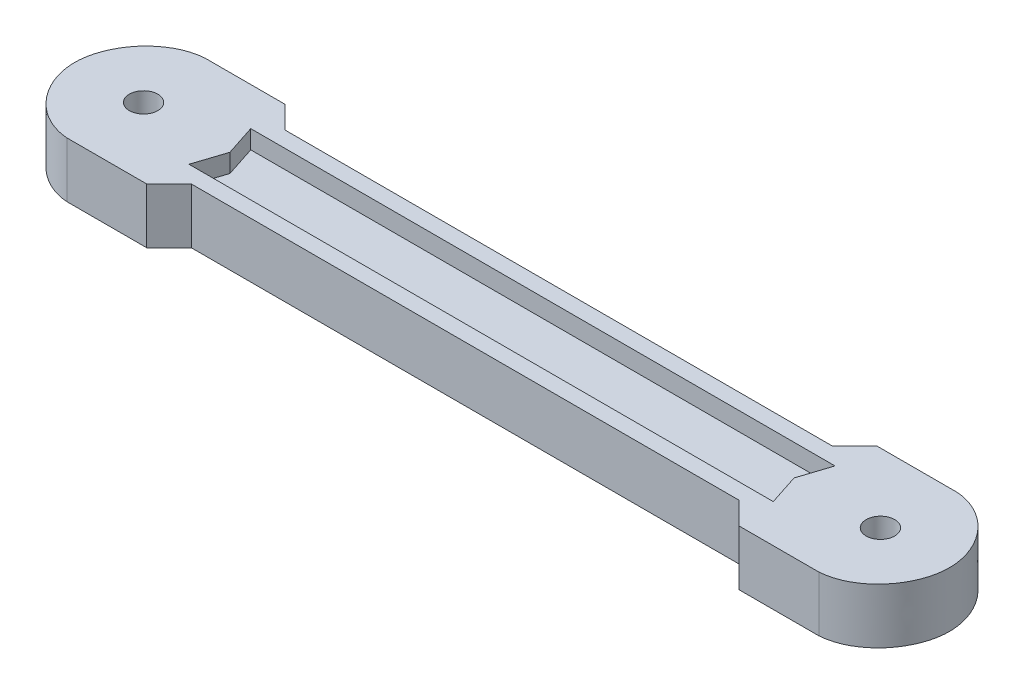
ISO-10303-21;
HEADER;
FILE_DESCRIPTION(('STEP AP214'),'2;1');
FILE_NAME('part.step','',(''),(''),'','','');
FILE_SCHEMA(('AUTOMOTIVE_DESIGN { 1 0 10303 214 1 1 1 1 }'));
ENDSEC;
DATA;
#1=APPLICATION_CONTEXT('core data for automotive mechanical design processes');
#2=APPLICATION_PROTOCOL_DEFINITION('international standard','automotive_design',2000,#1);
#3=PRODUCT_CONTEXT('',#1,'mechanical');
#4=PRODUCT('Part','Part','',(#3));
#5=PRODUCT_RELATED_PRODUCT_CATEGORY('part','',(#4));
#6=PRODUCT_DEFINITION_FORMATION('','',#4);
#7=PRODUCT_DEFINITION_CONTEXT('part definition',#1,'design');
#8=PRODUCT_DEFINITION('design','',#6,#7);
#9=PRODUCT_DEFINITION_SHAPE('','',#8);
#10=(LENGTH_UNIT() NAMED_UNIT(*) SI_UNIT(.MILLI.,.METRE.));
#11=(NAMED_UNIT(*) PLANE_ANGLE_UNIT() SI_UNIT($,.RADIAN.));
#12=(NAMED_UNIT(*) SI_UNIT($,.STERADIAN.) SOLID_ANGLE_UNIT());
#13=UNCERTAINTY_MEASURE_WITH_UNIT(LENGTH_MEASURE(1.E-05),#10,'distance_accuracy_value','');
#14=(GEOMETRIC_REPRESENTATION_CONTEXT(3) GLOBAL_UNCERTAINTY_ASSIGNED_CONTEXT((#13)) GLOBAL_UNIT_ASSIGNED_CONTEXT((#10,
#11,#12)) REPRESENTATION_CONTEXT('',''));
#15=CARTESIAN_POINT('',(0.,0.,0.));
#16=DIRECTION('',(0.,0.,1.));
#17=DIRECTION('',(1.,0.,0.));
#18=AXIS2_PLACEMENT_3D('',#15,#16,#17);
#19=CARTESIAN_POINT('',(-47.5,6.,-7.5));
#20=DIRECTION('',(0.,0.,1.));
#21=DIRECTION('',(1.,0.,0.));
#22=AXIS2_PLACEMENT_3D('',#19,#20,#21);
#23=PLANE('',#22);
#24=DIRECTION('',(0.,1.,0.));
#25=VECTOR('',#24,1.);
#26=CARTESIAN_POINT('',(40.8154783819914,-6.,-7.50000000000002));
#27=LINE('',#26,#25);
#28=CARTESIAN_POINT('',(40.8154783819915,0.,-7.50000000000001));
#29=VERTEX_POINT('',#28);
#30=CARTESIAN_POINT('',(40.8154783819915,6.,-7.50000000000001));
#31=VERTEX_POINT('',#30);
#32=EDGE_CURVE('E269',#29,#31,#27,.T.);
#33=ORIENTED_EDGE('',*,*,#32,.F.);
#34=DIRECTION('',(-1.,0.,0.));
#35=VECTOR('',#34,1.);
#36=CARTESIAN_POINT('',(-47.5,0.,-7.5));
#37=LINE('',#36,#35);
#38=CARTESIAN_POINT('',(32.1591580722005,0.,-7.50000000000001));
#39=VERTEX_POINT('',#38);
#40=EDGE_CURVE('E272',#29,#39,#37,.T.);
#41=ORIENTED_EDGE('',*,*,#40,.T.);
#42=DIRECTION('',(0.,1.,0.));
#43=VECTOR('',#42,1.);
#44=CARTESIAN_POINT('',(32.1591580722005,-6.,-7.50000000000002));
#45=LINE('',#44,#43);
#46=CARTESIAN_POINT('',(32.1591580722005,6.,-7.50000000000002));
#47=VERTEX_POINT('',#46);
#48=EDGE_CURVE('E335',#39,#47,#45,.T.);
#49=ORIENTED_EDGE('',*,*,#48,.T.);
#50=DIRECTION('',(-1.,0.,0.));
#51=VECTOR('',#50,1.);
#52=CARTESIAN_POINT('',(-47.5,6.,-7.5));
#53=LINE('',#52,#51);
#54=EDGE_CURVE('E274',#31,#47,#53,.T.);
#55=ORIENTED_EDGE('',*,*,#54,.F.);
#56=EDGE_LOOP('',(#33,#41,#49,#55));
#57=FACE_BOUND('',#56,.T.);
#58=ADVANCED_FACE('F33',(#57),#23,.F.);
#59=DIRECTION('',(0.,1.,0.));
#60=VECTOR('',#59,1.);
#61=CARTESIAN_POINT('',(-40.8154783819917,-6.,-7.5));
#62=LINE('',#61,#60);
#63=CARTESIAN_POINT('',(-40.8154783819918,6.,-7.5));
#64=VERTEX_POINT('',#63);
#65=CARTESIAN_POINT('',(-40.8154783819918,0.,-7.5));
#66=VERTEX_POINT('',#65);
#67=EDGE_CURVE('E351',#64,#66,#62,.F.);
#68=ORIENTED_EDGE('',*,*,#67,.F.);
#69=CARTESIAN_POINT('',(-32.1591580722005,6.,-7.50000000000002));
#70=VERTEX_POINT('',#69);
#71=EDGE_CURVE('E354',#70,#64,#53,.T.);
#72=ORIENTED_EDGE('',*,*,#71,.F.);
#73=DIRECTION('',(0.,1.,0.));
#74=VECTOR('',#73,1.);
#75=CARTESIAN_POINT('',(-32.1591580722005,-6.,-7.50000000000002));
#76=LINE('',#75,#74);
#77=CARTESIAN_POINT('',(-32.1591580722005,0.,-7.50000000000002));
#78=VERTEX_POINT('',#77);
#79=EDGE_CURVE('E331',#78,#70,#76,.T.);
#80=ORIENTED_EDGE('',*,*,#79,.F.);
#81=EDGE_CURVE('E55',#78,#66,#37,.T.);
#82=ORIENTED_EDGE('',*,*,#81,.T.);
#83=EDGE_LOOP('',(#68,#72,#80,#82));
#84=FACE_BOUND('',#83,.T.);
#85=ADVANCED_FACE('F255',(#84),#23,.F.);
#86=CARTESIAN_POINT('',(-47.5,6.,7.5));
#87=DIRECTION('',(0.,0.,-1.));
#88=DIRECTION('',(-1.,0.,0.));
#89=AXIS2_PLACEMENT_3D('',#86,#87,#88);
#90=PLANE('',#89);
#91=DIRECTION('',(1.,0.,0.));
#92=VECTOR('',#91,1.);
#93=CARTESIAN_POINT('',(-47.5,0.,7.5));
#94=LINE('',#93,#92);
#95=CARTESIAN_POINT('',(32.1591580722005,0.,7.50000000000002));
#96=VERTEX_POINT('',#95);
#97=CARTESIAN_POINT('',(40.8154783799446,0.,7.50000000000002));
#98=VERTEX_POINT('',#97);
#99=EDGE_CURVE('E286',#96,#98,#94,.T.);
#100=ORIENTED_EDGE('',*,*,#99,.T.);
#101=DIRECTION('',(0.,1.,0.));
#102=VECTOR('',#101,1.);
#103=CARTESIAN_POINT('',(40.8154783799445,-6.,7.50000000000001));
#104=LINE('',#103,#102);
#105=CARTESIAN_POINT('',(40.8154783799446,6.,7.50000000000001));
#106=VERTEX_POINT('',#105);
#107=EDGE_CURVE('E277',#106,#98,#104,.F.);
#108=ORIENTED_EDGE('',*,*,#107,.F.);
#109=DIRECTION('',(1.,0.,0.));
#110=VECTOR('',#109,1.);
#111=CARTESIAN_POINT('',(-47.5,6.,7.5));
#112=LINE('',#111,#110);
#113=CARTESIAN_POINT('',(32.1591580722005,6.,7.50000000000002));
#114=VERTEX_POINT('',#113);
#115=EDGE_CURVE('E291',#114,#106,#112,.T.);
#116=ORIENTED_EDGE('',*,*,#115,.F.);
#117=DIRECTION('',(0.,1.,0.));
#118=VECTOR('',#117,1.);
#119=CARTESIAN_POINT('',(32.1591580722005,-6.,7.50000000000002));
#120=LINE('',#119,#118);
#121=EDGE_CURVE('E340',#96,#114,#120,.T.);
#122=ORIENTED_EDGE('',*,*,#121,.F.);
#123=EDGE_LOOP('',(#100,#108,#116,#122));
#124=FACE_BOUND('',#123,.T.);
#125=ADVANCED_FACE('F253',(#124),#90,.F.);
#126=DIRECTION('',(0.,1.,0.));
#127=VECTOR('',#126,1.);
#128=CARTESIAN_POINT('',(-40.8154783799448,-6.,7.5));
#129=LINE('',#128,#127);
#130=CARTESIAN_POINT('',(-40.8154783799449,0.,7.49999999999999));
#131=VERTEX_POINT('',#130);
#132=CARTESIAN_POINT('',(-40.8154783799449,6.,7.49999999999999));
#133=VERTEX_POINT('',#132);
#134=EDGE_CURVE('E333',#131,#133,#129,.T.);
#135=ORIENTED_EDGE('',*,*,#134,.F.);
#136=CARTESIAN_POINT('',(-32.1591580722005,0.,7.5));
#137=VERTEX_POINT('',#136);
#138=EDGE_CURVE('E288',#131,#137,#94,.T.);
#139=ORIENTED_EDGE('',*,*,#138,.T.);
#140=DIRECTION('',(0.,1.,0.));
#141=VECTOR('',#140,1.);
#142=CARTESIAN_POINT('',(-32.1591580722005,-6.,7.50000000000002));
#143=LINE('',#142,#141);
#144=CARTESIAN_POINT('',(-32.1591580722005,6.,7.50000000000002));
#145=VERTEX_POINT('',#144);
#146=EDGE_CURVE('E346',#137,#145,#143,.T.);
#147=ORIENTED_EDGE('',*,*,#146,.T.);
#148=EDGE_CURVE('E300',#133,#145,#112,.T.);
#149=ORIENTED_EDGE('',*,*,#148,.F.);
#150=EDGE_LOOP('',(#135,#139,#147,#149));
#151=FACE_BOUND('',#150,.T.);
#152=ADVANCED_FACE('F249',(#151),#90,.F.);
#153=CARTESIAN_POINT('',(0.,6.,0.));
#154=DIRECTION('',(0.,-1.,0.));
#155=DIRECTION('',(0.,0.,-1.));
#156=AXIS2_PLACEMENT_3D('',#153,#154,#155);
#157=PLANE('',#156);
#158=DIRECTION('',(1.,0.,0.));
#159=VECTOR('',#158,1.);
#160=CARTESIAN_POINT('',(-31.7174150880341,6.,3.35193649705162));
#161=LINE('',#160,#159);
#162=CARTESIAN_POINT('',(-31.7174150880341,6.,3.35193649705162));
#163=VERTEX_POINT('',#162);
#164=CARTESIAN_POINT('',(31.7174150880341,6.,3.35193649705162));
#165=VERTEX_POINT('',#164);
#166=EDGE_CURVE('E194',#163,#165,#161,.T.);
#167=ORIENTED_EDGE('',*,*,#166,.F.);
#168=DIRECTION('',(-0.309876944964652,0.,0.950776671453067));
#169=VECTOR('',#168,1.);
#170=CARTESIAN_POINT('',(-30.6249526069823,6.,0.));
#171=LINE('',#170,#169);
#172=CARTESIAN_POINT('',(-30.6249526069823,6.,0.));
#173=VERTEX_POINT('',#172);
#174=EDGE_CURVE('E47',#173,#163,#171,.T.);
#175=ORIENTED_EDGE('',*,*,#174,.F.);
#176=DIRECTION('',(0.309876944964652,0.,0.950776671453067));
#177=VECTOR('',#176,1.);
#178=CARTESIAN_POINT('',(-30.6249526069823,6.,0.));
#179=LINE('',#178,#177);
#180=CARTESIAN_POINT('',(-31.7174150880341,6.,-3.35193649705162));
#181=VERTEX_POINT('',#180);
#182=EDGE_CURVE('E180',#181,#173,#179,.T.);
#183=ORIENTED_EDGE('',*,*,#182,.F.);
#184=DIRECTION('',(-1.,0.,0.));
#185=VECTOR('',#184,1.);
#186=CARTESIAN_POINT('',(-31.7174150880341,6.,-3.35193649705162));
#187=LINE('',#186,#185);
#188=CARTESIAN_POINT('',(31.7174150880341,6.,-3.35193649705162));
#189=VERTEX_POINT('',#188);
#190=EDGE_CURVE('E183',#189,#181,#187,.T.);
#191=ORIENTED_EDGE('',*,*,#190,.F.);
#192=DIRECTION('',(0.309876944964652,0.,-0.950776671453067));
#193=VECTOR('',#192,1.);
#194=CARTESIAN_POINT('',(30.6249526069823,6.,0.));
#195=LINE('',#194,#193);
#196=CARTESIAN_POINT('',(30.6249526069823,6.,0.));
#197=VERTEX_POINT('',#196);
#198=EDGE_CURVE('E199',#197,#189,#195,.T.);
#199=ORIENTED_EDGE('',*,*,#198,.F.);
#200=DIRECTION('',(-0.309876944964652,0.,-0.950776671453067));
#201=VECTOR('',#200,1.);
#202=CARTESIAN_POINT('',(30.6249526069823,6.,0.));
#203=LINE('',#202,#201);
#204=EDGE_CURVE('E196',#165,#197,#203,.T.);
#205=ORIENTED_EDGE('',*,*,#204,.F.);
#206=EDGE_LOOP('',(#167,#175,#183,#191,#199,#205));
#207=FACE_BOUND('',#206,.T.);
#208=CARTESIAN_POINT('',(-40.,6.,0.));
#209=DIRECTION('',(0.,-1.,0.));
#210=DIRECTION('',(0.,0.,-1.));
#211=AXIS2_PLACEMENT_3D('',#208,#209,#210);
#212=CIRCLE('',#211,1.54999999999999);
#213=CARTESIAN_POINT('',(-40.,6.,-1.54999999999999));
#214=VERTEX_POINT('',#213);
#215=EDGE_CURVE('E222',#214,#214,#212,.T.);
#216=ORIENTED_EDGE('',*,*,#215,.T.);
#217=EDGE_LOOP('',(#216));
#218=FACE_BOUND('',#217,.T.);
#219=CARTESIAN_POINT('',(40.,6.,0.));
#220=DIRECTION('',(0.,-1.,0.));
#221=DIRECTION('',(0.,0.,-1.));
#222=AXIS2_PLACEMENT_3D('',#219,#220,#221);
#223=CIRCLE('',#222,1.54999999999999);
#224=CARTESIAN_POINT('',(40.,6.,-1.54999999999999));
#225=VERTEX_POINT('',#224);
#226=EDGE_CURVE('E217',#225,#225,#223,.T.);
#227=ORIENTED_EDGE('',*,*,#226,.T.);
#228=EDGE_LOOP('',(#227));
#229=FACE_BOUND('',#228,.T.);
#230=DIRECTION('',(-0.707106781186555,0.,-0.70710678118654));
#231=VECTOR('',#230,1.);
#232=CARTESIAN_POINT('',(-32.1591580722005,6.,-7.50000000000002));
#233=LINE('',#232,#231);
#234=CARTESIAN_POINT('',(-29.7385162336034,6.,-5.07935816140295));
#235=VERTEX_POINT('',#234);
#236=EDGE_CURVE('E329',#235,#70,#233,.T.);
#237=ORIENTED_EDGE('',*,*,#236,.T.);
#238=ORIENTED_EDGE('',*,*,#71,.T.);
#239=CARTESIAN_POINT('',(-40.,6.,-7.50000000000002));
#240=CARTESIAN_POINT('',(-44.0851812404319,6.,-7.7739570541338));
#241=CARTESIAN_POINT('',(-50.9148187585371,6.,8.00605583846533E-10));
#242=CARTESIAN_POINT('',(-44.0851812424938,6.,7.77395705319477));
#243=CARTESIAN_POINT('',(-40.,6.,7.50000000000002));
#244=B_SPLINE_CURVE_WITH_KNOTS('',3,(#239,#240,#241,#242,#243),.UNSPECIFIED.,.F.,.F.,(4,1,4),
(0.,0.499999999989353,1.),.UNSPECIFIED.);
#245=EDGE_CURVE('E225',#64,#133,#244,.T.);
#246=ORIENTED_EDGE('',*,*,#245,.T.);
#247=ORIENTED_EDGE('',*,*,#148,.T.);
#248=DIRECTION('',(0.707106781186555,0.,-0.70710678118654));
#249=VECTOR('',#248,1.);
#250=CARTESIAN_POINT('',(-32.1591580722005,6.,7.50000000000002));
#251=LINE('',#250,#249);
#252=CARTESIAN_POINT('',(-29.7385162336034,6.,5.07935816140295));
#253=VERTEX_POINT('',#252);
#254=EDGE_CURVE('E366',#145,#253,#251,.T.);
#255=ORIENTED_EDGE('',*,*,#254,.T.);
#256=DIRECTION('',(1.,0.,0.));
#257=VECTOR('',#256,1.);
#258=CARTESIAN_POINT('',(-29.7385162336034,6.,5.07935816140295));
#259=LINE('',#258,#257);
#260=CARTESIAN_POINT('',(29.7385162336034,6.,5.07935816140295));
#261=VERTEX_POINT('',#260);
#262=EDGE_CURVE('E380',#253,#261,#259,.T.);
#263=ORIENTED_EDGE('',*,*,#262,.T.);
#264=DIRECTION('',(0.707106781186555,0.,0.70710678118654));
#265=VECTOR('',#264,1.);
#266=CARTESIAN_POINT('',(32.1591580722005,6.,7.50000000000002));
#267=LINE('',#266,#265);
#268=EDGE_CURVE('E376',#261,#114,#267,.T.);
#269=ORIENTED_EDGE('',*,*,#268,.T.);
#270=ORIENTED_EDGE('',*,*,#115,.T.);
#271=CARTESIAN_POINT('',(40.,6.,7.50000000000002));
#272=CARTESIAN_POINT('',(44.0851812424938,6.,7.77395705319477));
#273=CARTESIAN_POINT('',(50.9148187585372,6.,8.00606389292552E-10));
#274=CARTESIAN_POINT('',(44.0851812404319,6.,-7.7739570541338));
#275=CARTESIAN_POINT('',(40.,6.,-7.50000000000002));
#276=B_SPLINE_CURVE_WITH_KNOTS('',3,(#271,#272,#273,#274,#275),.UNSPECIFIED.,.F.,.F.,(4,1,4),
(0.,0.500000000010647,1.),.UNSPECIFIED.);
#277=EDGE_CURVE('E379',#106,#31,#276,.T.);
#278=ORIENTED_EDGE('',*,*,#277,.T.);
#279=ORIENTED_EDGE('',*,*,#54,.T.);
#280=DIRECTION('',(-0.707106781186555,0.,0.70710678118654));
#281=VECTOR('',#280,1.);
#282=CARTESIAN_POINT('',(32.1591580722005,6.,-7.50000000000002));
#283=LINE('',#282,#281);
#284=CARTESIAN_POINT('',(29.7385162336034,6.,-5.07935816140295));
#285=VERTEX_POINT('',#284);
#286=EDGE_CURVE('E388',#47,#285,#283,.T.);
#287=ORIENTED_EDGE('',*,*,#286,.T.);
#288=DIRECTION('',(-1.,0.,0.));
#289=VECTOR('',#288,1.);
#290=CARTESIAN_POINT('',(-29.7385162336034,6.,-5.07935816140295));
#291=LINE('',#290,#289);
#292=EDGE_CURVE('E394',#285,#235,#291,.T.);
#293=ORIENTED_EDGE('',*,*,#292,.T.);
#294=EDGE_LOOP('',(#237,#238,#246,#247,#255,#263,#269,#270,#278,#279,#287,#293));
#295=FACE_BOUND('',#294,.T.);
#296=ADVANCED_FACE('F246',(#207,#218,#229,#295),#157,.F.);
#297=CARTESIAN_POINT('',(0.,0.,0.));
#298=DIRECTION('',(0.,-1.,0.));
#299=DIRECTION('',(0.,0.,-1.));
#300=AXIS2_PLACEMENT_3D('',#297,#298,#299);
#301=PLANE('',#300);
#302=CARTESIAN_POINT('',(-40.,0.,0.));
#303=DIRECTION('',(0.,-1.,0.));
#304=DIRECTION('',(0.,0.,-1.));
#305=AXIS2_PLACEMENT_3D('',#302,#303,#304);
#306=CIRCLE('',#305,1.54999999999999);
#307=CARTESIAN_POINT('',(-40.,0.,-1.54999999999999));
#308=VERTEX_POINT('',#307);
#309=EDGE_CURVE('E214',#308,#308,#306,.T.);
#310=ORIENTED_EDGE('',*,*,#309,.F.);
#311=EDGE_LOOP('',(#310));
#312=FACE_BOUND('',#311,.T.);
#313=CARTESIAN_POINT('',(40.,0.,0.));
#314=DIRECTION('',(0.,-1.,0.));
#315=DIRECTION('',(0.,0.,1.));
#316=AXIS2_PLACEMENT_3D('',#313,#314,#315);
#317=CIRCLE('',#316,1.54999999999999);
#318=CARTESIAN_POINT('',(40.,0.,1.54999999999999));
#319=VERTEX_POINT('',#318);
#320=EDGE_CURVE('E206',#319,#319,#317,.T.);
#321=ORIENTED_EDGE('',*,*,#320,.F.);
#322=EDGE_LOOP('',(#321));
#323=FACE_BOUND('',#322,.T.);
#324=ORIENTED_EDGE('',*,*,#81,.F.);
#325=DIRECTION('',(0.707106781186555,0.,0.70710678118654));
#326=VECTOR('',#325,1.);
#327=CARTESIAN_POINT('',(-12.3295790360999,0.,12.3295790361002));
#328=LINE('',#327,#326);
#329=CARTESIAN_POINT('',(-29.7385162336034,0.,-5.07935816140295));
#330=VERTEX_POINT('',#329);
#331=EDGE_CURVE('E11',#78,#330,#328,.T.);
#332=ORIENTED_EDGE('',*,*,#331,.T.);
#333=DIRECTION('',(1.,0.,0.));
#334=VECTOR('',#333,1.);
#335=CARTESIAN_POINT('',(0.,0.,-5.07935816140295));
#336=LINE('',#335,#334);
#337=CARTESIAN_POINT('',(29.7385162336034,0.,-5.07935816140295));
#338=VERTEX_POINT('',#337);
#339=EDGE_CURVE('E40',#330,#338,#336,.T.);
#340=ORIENTED_EDGE('',*,*,#339,.T.);
#341=DIRECTION('',(0.707106781186555,0.,-0.70710678118654));
#342=VECTOR('',#341,1.);
#343=CARTESIAN_POINT('',(12.3295790360999,0.,12.3295790361002));
#344=LINE('',#343,#342);
#345=EDGE_CURVE('E285',#338,#39,#344,.T.);
#346=ORIENTED_EDGE('',*,*,#345,.T.);
#347=ORIENTED_EDGE('',*,*,#40,.F.);
#348=CARTESIAN_POINT('',(40.,0.,7.50000000000002));
#349=CARTESIAN_POINT('',(44.0851812424938,0.,7.77395705319477));
#350=CARTESIAN_POINT('',(50.9148187585372,0.,8.00606389292552E-10));
#351=CARTESIAN_POINT('',(44.0851812404319,0.,-7.7739570541338));
#352=CARTESIAN_POINT('',(40.,0.,-7.50000000000002));
#353=B_SPLINE_CURVE_WITH_KNOTS('',3,(#348,#349,#350,#351,#352),.UNSPECIFIED.,.F.,.F.,(4,1,4),
(0.,0.500000000010647,1.),.UNSPECIFIED.);
#354=EDGE_CURVE('E283',#29,#98,#353,.F.);
#355=ORIENTED_EDGE('',*,*,#354,.T.);
#356=ORIENTED_EDGE('',*,*,#99,.F.);
#357=DIRECTION('',(-0.707106781186555,0.,-0.70710678118654));
#358=VECTOR('',#357,1.);
#359=CARTESIAN_POINT('',(12.3295790360999,0.,-12.3295790361002));
#360=LINE('',#359,#358);
#361=CARTESIAN_POINT('',(29.7385162336034,0.,5.07935816140295));
#362=VERTEX_POINT('',#361);
#363=EDGE_CURVE('E309',#96,#362,#360,.T.);
#364=ORIENTED_EDGE('',*,*,#363,.T.);
#365=DIRECTION('',(-1.,0.,0.));
#366=VECTOR('',#365,1.);
#367=CARTESIAN_POINT('',(0.,0.,5.07935816140295));
#368=LINE('',#367,#366);
#369=CARTESIAN_POINT('',(-29.7385162336034,0.,5.07935816140295));
#370=VERTEX_POINT('',#369);
#371=EDGE_CURVE('E306',#362,#370,#368,.T.);
#372=ORIENTED_EDGE('',*,*,#371,.T.);
#373=DIRECTION('',(-0.707106781186555,0.,0.70710678118654));
#374=VECTOR('',#373,1.);
#375=CARTESIAN_POINT('',(-12.3295790360999,0.,-12.3295790361002));
#376=LINE('',#375,#374);
#377=EDGE_CURVE('E299',#370,#137,#376,.T.);
#378=ORIENTED_EDGE('',*,*,#377,.T.);
#379=ORIENTED_EDGE('',*,*,#138,.F.);
#380=CARTESIAN_POINT('',(-40.,0.,-7.50000000000002));
#381=CARTESIAN_POINT('',(-44.0851812404319,0.,-7.7739570541338));
#382=CARTESIAN_POINT('',(-50.9148187585371,0.,8.00605583846533E-10));
#383=CARTESIAN_POINT('',(-44.0851812424938,0.,7.77395705319477));
#384=CARTESIAN_POINT('',(-40.,0.,7.50000000000002));
#385=B_SPLINE_CURVE_WITH_KNOTS('',3,(#380,#381,#382,#383,#384),.UNSPECIFIED.,.F.,.F.,(4,1,4),
(0.,0.499999999989353,1.),.UNSPECIFIED.);
#386=EDGE_CURVE('E294',#131,#66,#385,.F.);
#387=ORIENTED_EDGE('',*,*,#386,.T.);
#388=EDGE_LOOP('',(#324,#332,#340,#346,#347,#355,#356,#364,#372,#378,#379,#387));
#389=FACE_BOUND('',#388,.T.);
#390=ADVANCED_FACE('F243',(#312,#323,#389),#301,.T.);
#391=CARTESIAN_POINT('',(-40.,-6.,-7.50000000000002));
#392=CARTESIAN_POINT('',(-44.0851812404319,-6.,-7.7739570541338));
#393=CARTESIAN_POINT('',(-50.9148187585371,-6.,8.00605583846533E-10));
#394=CARTESIAN_POINT('',(-44.0851812424938,-6.,7.77395705319477));
#395=CARTESIAN_POINT('',(-40.,-6.,7.50000000000002));
#396=B_SPLINE_CURVE_WITH_KNOTS('',3,(#391,#392,#393,#394,#395),.UNSPECIFIED.,.F.,.F.,(4,1,4),
(0.,0.499999999989353,1.),.UNSPECIFIED.);
#397=DIRECTION('',(0.,1.,0.));
#398=VECTOR('',#397,1.);
#399=SURFACE_OF_LINEAR_EXTRUSION('',#396,#398);
#400=ORIENTED_EDGE('',*,*,#386,.F.);
#401=ORIENTED_EDGE('',*,*,#134,.T.);
#402=ORIENTED_EDGE('',*,*,#245,.F.);
#403=ORIENTED_EDGE('',*,*,#67,.T.);
#404=EDGE_LOOP('',(#400,#401,#402,#403));
#405=FACE_BOUND('',#404,.T.);
#406=ADVANCED_FACE('F238',(#405),#399,.T.);
#407=CARTESIAN_POINT('',(-32.1591580722005,-6.,7.50000000000002));
#408=DIRECTION('',(0.70710678118654,0.,0.707106781186555));
#409=DIRECTION('',(0.707106781186555,0.,-0.70710678118654));
#410=AXIS2_PLACEMENT_3D('',#407,#408,#409);
#411=PLANE('',#410);
#412=DIRECTION('',(0.,1.,0.));
#413=VECTOR('',#412,1.);
#414=CARTESIAN_POINT('',(-29.7385162336034,-6.,5.07935816140295));
#415=LINE('',#414,#413);
#416=EDGE_CURVE('E344',#370,#253,#415,.T.);
#417=ORIENTED_EDGE('',*,*,#416,.T.);
#418=ORIENTED_EDGE('',*,*,#254,.F.);
#419=ORIENTED_EDGE('',*,*,#146,.F.);
#420=ORIENTED_EDGE('',*,*,#377,.F.);
#421=EDGE_LOOP('',(#417,#418,#419,#420));
#422=FACE_BOUND('',#421,.T.);
#423=ADVANCED_FACE('F242',(#422),#411,.T.);
#424=CARTESIAN_POINT('',(-29.7385162336034,-6.,5.07935816140295));
#425=DIRECTION('',(0.,0.,1.));
#426=DIRECTION('',(1.,0.,0.));
#427=AXIS2_PLACEMENT_3D('',#424,#425,#426);
#428=PLANE('',#427);
#429=DIRECTION('',(0.,1.,0.));
#430=VECTOR('',#429,1.);
#431=CARTESIAN_POINT('',(29.7385162336034,-6.,5.07935816140295));
#432=LINE('',#431,#430);
#433=EDGE_CURVE('E342',#362,#261,#432,.T.);
#434=ORIENTED_EDGE('',*,*,#433,.T.);
#435=ORIENTED_EDGE('',*,*,#262,.F.);
#436=ORIENTED_EDGE('',*,*,#416,.F.);
#437=ORIENTED_EDGE('',*,*,#371,.F.);
#438=EDGE_LOOP('',(#434,#435,#436,#437));
#439=FACE_BOUND('',#438,.T.);
#440=ADVANCED_FACE('F369',(#439),#428,.T.);
#441=CARTESIAN_POINT('',(32.1591580722005,-6.,7.50000000000002));
#442=DIRECTION('',(-0.70710678118654,0.,0.707106781186555));
#443=DIRECTION('',(0.707106781186555,0.,0.70710678118654));
#444=AXIS2_PLACEMENT_3D('',#441,#442,#443);
#445=PLANE('',#444);
#446=ORIENTED_EDGE('',*,*,#121,.T.);
#447=ORIENTED_EDGE('',*,*,#268,.F.);
#448=ORIENTED_EDGE('',*,*,#433,.F.);
#449=ORIENTED_EDGE('',*,*,#363,.F.);
#450=EDGE_LOOP('',(#446,#447,#448,#449));
#451=FACE_BOUND('',#450,.T.);
#452=ADVANCED_FACE('F373',(#451),#445,.T.);
#453=CARTESIAN_POINT('',(40.,-6.,7.50000000000002));
#454=CARTESIAN_POINT('',(44.0851812424938,-6.,7.77395705319477));
#455=CARTESIAN_POINT('',(50.9148187585372,-6.,8.00606389292552E-10));
#456=CARTESIAN_POINT('',(44.0851812404319,-6.,-7.7739570541338));
#457=CARTESIAN_POINT('',(40.,-6.,-7.50000000000002));
#458=B_SPLINE_CURVE_WITH_KNOTS('',3,(#453,#454,#455,#456,#457),.UNSPECIFIED.,.F.,.F.,(4,1,4),
(0.,0.500000000010647,1.),.UNSPECIFIED.);
#459=DIRECTION('',(0.,1.,0.));
#460=VECTOR('',#459,1.);
#461=SURFACE_OF_LINEAR_EXTRUSION('',#458,#460);
#462=ORIENTED_EDGE('',*,*,#354,.F.);
#463=ORIENTED_EDGE('',*,*,#32,.T.);
#464=ORIENTED_EDGE('',*,*,#277,.F.);
#465=ORIENTED_EDGE('',*,*,#107,.T.);
#466=EDGE_LOOP('',(#462,#463,#464,#465));
#467=FACE_BOUND('',#466,.T.);
#468=ADVANCED_FACE('F401',(#467),#461,.T.);
#469=CARTESIAN_POINT('',(-32.1591580722005,-6.,-7.50000000000002));
#470=DIRECTION('',(0.70710678118654,0.,-0.707106781186555));
#471=DIRECTION('',(-0.707106781186555,0.,-0.70710678118654));
#472=AXIS2_PLACEMENT_3D('',#469,#470,#471);
#473=PLANE('',#472);
#474=ORIENTED_EDGE('',*,*,#79,.T.);
#475=ORIENTED_EDGE('',*,*,#236,.F.);
#476=DIRECTION('',(0.,1.,0.));
#477=VECTOR('',#476,1.);
#478=CARTESIAN_POINT('',(-29.7385162336034,-6.,-5.07935816140295));
#479=LINE('',#478,#477);
#480=EDGE_CURVE('E323',#330,#235,#479,.T.);
#481=ORIENTED_EDGE('',*,*,#480,.F.);
#482=ORIENTED_EDGE('',*,*,#331,.F.);
#483=EDGE_LOOP('',(#474,#475,#481,#482));
#484=FACE_BOUND('',#483,.T.);
#485=ADVANCED_FACE('F327',(#484),#473,.T.);
#486=CARTESIAN_POINT('',(-29.7385162336034,-6.,-5.07935816140295));
#487=DIRECTION('',(0.,0.,-1.));
#488=DIRECTION('',(-1.,0.,0.));
#489=AXIS2_PLACEMENT_3D('',#486,#487,#488);
#490=PLANE('',#489);
#491=ORIENTED_EDGE('',*,*,#480,.T.);
#492=ORIENTED_EDGE('',*,*,#292,.F.);
#493=DIRECTION('',(0.,1.,0.));
#494=VECTOR('',#493,1.);
#495=CARTESIAN_POINT('',(29.7385162336034,-6.,-5.07935816140295));
#496=LINE('',#495,#494);
#497=EDGE_CURVE('E325',#338,#285,#496,.T.);
#498=ORIENTED_EDGE('',*,*,#497,.F.);
#499=ORIENTED_EDGE('',*,*,#339,.F.);
#500=EDGE_LOOP('',(#491,#492,#498,#499));
#501=FACE_BOUND('',#500,.T.);
#502=ADVANCED_FACE('F321',(#501),#490,.T.);
#503=CARTESIAN_POINT('',(32.1591580722005,-6.,-7.50000000000002));
#504=DIRECTION('',(-0.70710678118654,0.,-0.707106781186555));
#505=DIRECTION('',(-0.707106781186555,0.,0.70710678118654));
#506=AXIS2_PLACEMENT_3D('',#503,#504,#505);
#507=PLANE('',#506);
#508=ORIENTED_EDGE('',*,*,#497,.T.);
#509=ORIENTED_EDGE('',*,*,#286,.F.);
#510=ORIENTED_EDGE('',*,*,#48,.F.);
#511=ORIENTED_EDGE('',*,*,#345,.F.);
#512=EDGE_LOOP('',(#508,#509,#510,#511));
#513=FACE_BOUND('',#512,.T.);
#514=ADVANCED_FACE('F411',(#513),#507,.T.);
#515=CARTESIAN_POINT('',(40.,12.,0.));
#516=DIRECTION('',(0.,-1.,0.));
#517=DIRECTION('',(0.,0.,-1.));
#518=AXIS2_PLACEMENT_3D('',#515,#516,#517);
#519=CYLINDRICAL_SURFACE('',#518,1.54999999999999);
#520=ORIENTED_EDGE('',*,*,#320,.T.);
#521=EDGE_LOOP('',(#520));
#522=FACE_BOUND('',#521,.T.);
#523=ORIENTED_EDGE('',*,*,#226,.F.);
#524=EDGE_LOOP('',(#523));
#525=FACE_BOUND('',#524,.T.);
#526=ADVANCED_FACE('F490',(#522,#525),#519,.F.);
#527=CARTESIAN_POINT('',(-40.,12.,0.));
#528=DIRECTION('',(0.,-1.,0.));
#529=DIRECTION('',(0.,0.,-1.));
#530=AXIS2_PLACEMENT_3D('',#527,#528,#529);
#531=CYLINDRICAL_SURFACE('',#530,1.54999999999999);
#532=ORIENTED_EDGE('',*,*,#309,.T.);
#533=EDGE_LOOP('',(#532));
#534=FACE_BOUND('',#533,.T.);
#535=ORIENTED_EDGE('',*,*,#215,.F.);
#536=EDGE_LOOP('',(#535));
#537=FACE_BOUND('',#536,.T.);
#538=ADVANCED_FACE('F497',(#534,#537),#531,.F.);
#539=CARTESIAN_POINT('',(-30.6249526069823,4.,0.));
#540=DIRECTION('',(-0.950776671453067,0.,-0.309876944964652));
#541=DIRECTION('',(-0.309876944964652,0.,0.950776671453067));
#542=AXIS2_PLACEMENT_3D('',#539,#540,#541);
#543=PLANE('',#542);
#544=ORIENTED_EDGE('',*,*,#174,.T.);
#545=DIRECTION('',(0.,1.,0.));
#546=VECTOR('',#545,1.);
#547=CARTESIAN_POINT('',(-31.7174150880341,4.,3.35193649705162));
#548=LINE('',#547,#546);
#549=CARTESIAN_POINT('',(-31.7174150880341,4.,3.35193649705162));
#550=VERTEX_POINT('',#549);
#551=EDGE_CURVE('E157',#550,#163,#548,.T.);
#552=ORIENTED_EDGE('',*,*,#551,.F.);
#553=DIRECTION('',(-0.309876944964652,0.,0.950776671453067));
#554=VECTOR('',#553,1.);
#555=CARTESIAN_POINT('',(-30.6249526069823,4.,0.));
#556=LINE('',#555,#554);
#557=CARTESIAN_POINT('',(-30.6249526069823,4.,0.));
#558=VERTEX_POINT('',#557);
#559=EDGE_CURVE('E161',#558,#550,#556,.T.);
#560=ORIENTED_EDGE('',*,*,#559,.F.);
#561=DIRECTION('',(0.,1.,0.));
#562=VECTOR('',#561,1.);
#563=CARTESIAN_POINT('',(-30.6249526069823,4.,0.));
#564=LINE('',#563,#562);
#565=EDGE_CURVE('E204',#558,#173,#564,.T.);
#566=ORIENTED_EDGE('',*,*,#565,.T.);
#567=EDGE_LOOP('',(#544,#552,#560,#566));
#568=FACE_BOUND('',#567,.T.);
#569=ADVANCED_FACE('F159',(#568),#543,.F.);
#570=CARTESIAN_POINT('',(-30.6249526069823,4.,0.));
#571=DIRECTION('',(-0.950776671453067,0.,0.309876944964652));
#572=DIRECTION('',(0.309876944964652,0.,0.950776671453067));
#573=AXIS2_PLACEMENT_3D('',#570,#571,#572);
#574=PLANE('',#573);
#575=ORIENTED_EDGE('',*,*,#182,.T.);
#576=ORIENTED_EDGE('',*,*,#565,.F.);
#577=DIRECTION('',(0.309876944964652,0.,0.950776671453067));
#578=VECTOR('',#577,1.);
#579=CARTESIAN_POINT('',(-30.6249526069823,4.,0.));
#580=LINE('',#579,#578);
#581=CARTESIAN_POINT('',(-31.7174150880341,4.,-3.35193649705162));
#582=VERTEX_POINT('',#581);
#583=EDGE_CURVE('E167',#582,#558,#580,.T.);
#584=ORIENTED_EDGE('',*,*,#583,.F.);
#585=DIRECTION('',(0.,1.,0.));
#586=VECTOR('',#585,1.);
#587=CARTESIAN_POINT('',(-31.7174150880341,4.,-3.35193649705162));
#588=LINE('',#587,#586);
#589=EDGE_CURVE('E207',#582,#181,#588,.T.);
#590=ORIENTED_EDGE('',*,*,#589,.T.);
#591=EDGE_LOOP('',(#575,#576,#584,#590));
#592=FACE_BOUND('',#591,.T.);
#593=ADVANCED_FACE('F512',(#592),#574,.F.);
#594=CARTESIAN_POINT('',(-31.7174150880341,4.,-3.35193649705162));
#595=DIRECTION('',(0.,0.,-1.));
#596=DIRECTION('',(-1.,0.,0.));
#597=AXIS2_PLACEMENT_3D('',#594,#595,#596);
#598=PLANE('',#597);
#599=ORIENTED_EDGE('',*,*,#190,.T.);
#600=ORIENTED_EDGE('',*,*,#589,.F.);
#601=DIRECTION('',(-1.,0.,0.));
#602=VECTOR('',#601,1.);
#603=CARTESIAN_POINT('',(-31.7174150880341,4.,-3.35193649705162));
#604=LINE('',#603,#602);
#605=CARTESIAN_POINT('',(31.7174150880341,4.,-3.35193649705162));
#606=VERTEX_POINT('',#605);
#607=EDGE_CURVE('E190',#606,#582,#604,.T.);
#608=ORIENTED_EDGE('',*,*,#607,.F.);
#609=DIRECTION('',(0.,1.,0.));
#610=VECTOR('',#609,1.);
#611=CARTESIAN_POINT('',(31.7174150880341,4.,-3.35193649705162));
#612=LINE('',#611,#610);
#613=EDGE_CURVE('E209',#606,#189,#612,.T.);
#614=ORIENTED_EDGE('',*,*,#613,.T.);
#615=EDGE_LOOP('',(#599,#600,#608,#614));
#616=FACE_BOUND('',#615,.T.);
#617=ADVANCED_FACE('F520',(#616),#598,.F.);
#618=CARTESIAN_POINT('',(30.6249526069823,4.,0.));
#619=DIRECTION('',(0.950776671453067,0.,0.309876944964652));
#620=DIRECTION('',(0.309876944964652,0.,-0.950776671453067));
#621=AXIS2_PLACEMENT_3D('',#618,#619,#620);
#622=PLANE('',#621);
#623=ORIENTED_EDGE('',*,*,#198,.T.);
#624=ORIENTED_EDGE('',*,*,#613,.F.);
#625=DIRECTION('',(0.309876944964652,0.,-0.950776671453067));
#626=VECTOR('',#625,1.);
#627=CARTESIAN_POINT('',(30.6249526069823,4.,0.));
#628=LINE('',#627,#626);
#629=CARTESIAN_POINT('',(30.6249526069823,4.,0.));
#630=VERTEX_POINT('',#629);
#631=EDGE_CURVE('E187',#630,#606,#628,.T.);
#632=ORIENTED_EDGE('',*,*,#631,.F.);
#633=DIRECTION('',(0.,1.,0.));
#634=VECTOR('',#633,1.);
#635=CARTESIAN_POINT('',(30.6249526069823,4.,0.));
#636=LINE('',#635,#634);
#637=EDGE_CURVE('E211',#630,#197,#636,.T.);
#638=ORIENTED_EDGE('',*,*,#637,.T.);
#639=EDGE_LOOP('',(#623,#624,#632,#638));
#640=FACE_BOUND('',#639,.T.);
#641=ADVANCED_FACE('F529',(#640),#622,.F.);
#642=CARTESIAN_POINT('',(30.6249526069823,4.,0.));
#643=DIRECTION('',(0.950776671453067,0.,-0.309876944964652));
#644=DIRECTION('',(-0.309876944964652,0.,-0.950776671453067));
#645=AXIS2_PLACEMENT_3D('',#642,#643,#644);
#646=PLANE('',#645);
#647=ORIENTED_EDGE('',*,*,#204,.T.);
#648=ORIENTED_EDGE('',*,*,#637,.F.);
#649=DIRECTION('',(-0.309876944964652,0.,-0.950776671453067));
#650=VECTOR('',#649,1.);
#651=CARTESIAN_POINT('',(30.6249526069823,4.,0.));
#652=LINE('',#651,#650);
#653=CARTESIAN_POINT('',(31.7174150880341,4.,3.35193649705162));
#654=VERTEX_POINT('',#653);
#655=EDGE_CURVE('E175',#654,#630,#652,.T.);
#656=ORIENTED_EDGE('',*,*,#655,.F.);
#657=DIRECTION('',(0.,1.,0.));
#658=VECTOR('',#657,1.);
#659=CARTESIAN_POINT('',(31.7174150880341,4.,3.35193649705162));
#660=LINE('',#659,#658);
#661=EDGE_CURVE('E166',#654,#165,#660,.T.);
#662=ORIENTED_EDGE('',*,*,#661,.T.);
#663=EDGE_LOOP('',(#647,#648,#656,#662));
#664=FACE_BOUND('',#663,.T.);
#665=ADVANCED_FACE('F538',(#664),#646,.F.);
#666=CARTESIAN_POINT('',(-31.7174150880341,4.,3.35193649705162));
#667=DIRECTION('',(0.,0.,1.));
#668=DIRECTION('',(1.,0.,0.));
#669=AXIS2_PLACEMENT_3D('',#666,#667,#668);
#670=PLANE('',#669);
#671=ORIENTED_EDGE('',*,*,#166,.T.);
#672=ORIENTED_EDGE('',*,*,#661,.F.);
#673=DIRECTION('',(1.,0.,0.));
#674=VECTOR('',#673,1.);
#675=CARTESIAN_POINT('',(-31.7174150880341,4.,3.35193649705162));
#676=LINE('',#675,#674);
#677=EDGE_CURVE('E170',#550,#654,#676,.T.);
#678=ORIENTED_EDGE('',*,*,#677,.F.);
#679=ORIENTED_EDGE('',*,*,#551,.T.);
#680=EDGE_LOOP('',(#671,#672,#678,#679));
#681=FACE_BOUND('',#680,.T.);
#682=ADVANCED_FACE('F171',(#681),#670,.F.);
#683=CARTESIAN_POINT('',(0.,4.,0.));
#684=DIRECTION('',(0.,1.,0.));
#685=DIRECTION('',(0.,0.,1.));
#686=AXIS2_PLACEMENT_3D('',#683,#684,#685);
#687=PLANE('',#686);
#688=ORIENTED_EDGE('',*,*,#559,.T.);
#689=ORIENTED_EDGE('',*,*,#677,.T.);
#690=ORIENTED_EDGE('',*,*,#655,.T.);
#691=ORIENTED_EDGE('',*,*,#631,.T.);
#692=ORIENTED_EDGE('',*,*,#607,.T.);
#693=ORIENTED_EDGE('',*,*,#583,.T.);
#694=EDGE_LOOP('',(#688,#689,#690,#691,#692,#693));
#695=FACE_BOUND('',#694,.T.);
#696=ADVANCED_FACE('F177',(#695),#687,.T.);
#697=CLOSED_SHELL('',(#58,#85,#125,#152,#296,#390,#406,#423,#440,#452,#468,#485,#502,#514,#526,
#538,#569,#593,#617,#641,#665,#682,#696));
#698=MANIFOLD_SOLID_BREP('B2',#697);
#699=ADVANCED_BREP_SHAPE_REPRESENTATION('',(#18,#698),#14);
#700=SHAPE_DEFINITION_REPRESENTATION(#9,#699);
ENDSEC;
END-ISO-10303-21;
